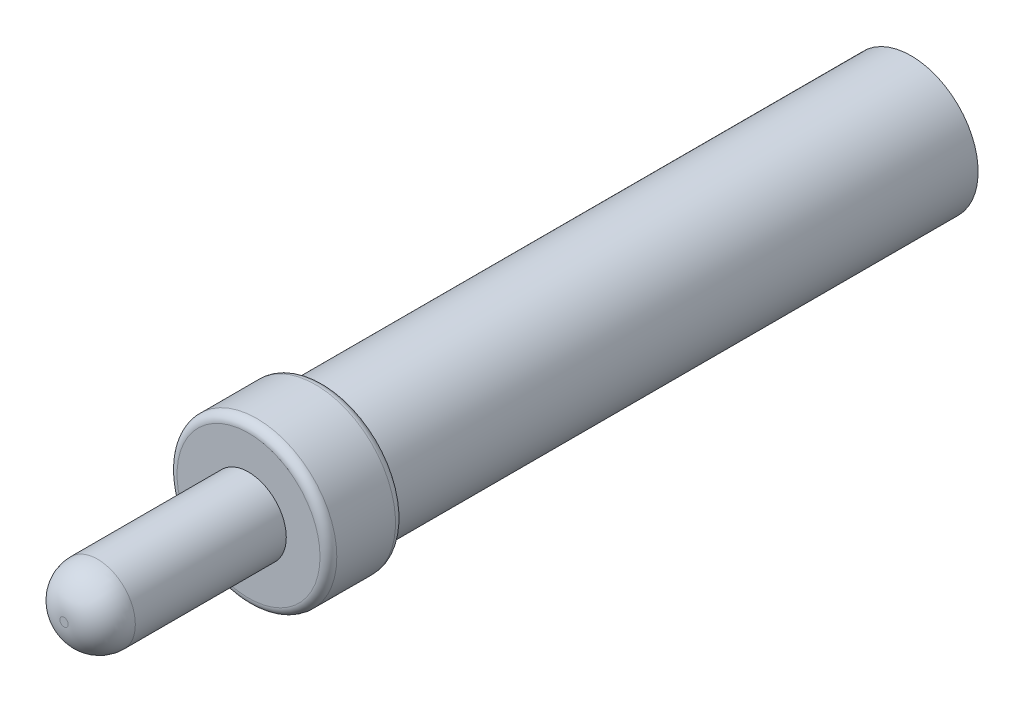
ISO-10303-21;
HEADER;
FILE_DESCRIPTION(('STEP AP214'),'2;1');
FILE_NAME('part.step','',(''),(''),'','','');
FILE_SCHEMA(('AUTOMOTIVE_DESIGN { 1 0 10303 214 1 1 1 1 }'));
ENDSEC;
DATA;
#1=APPLICATION_CONTEXT('core data for automotive mechanical design processes');
#2=APPLICATION_PROTOCOL_DEFINITION('international standard','automotive_design',2000,#1);
#3=PRODUCT_CONTEXT('',#1,'mechanical');
#4=PRODUCT('Part','Part','',(#3));
#5=PRODUCT_RELATED_PRODUCT_CATEGORY('part','',(#4));
#6=PRODUCT_DEFINITION_FORMATION('','',#4);
#7=PRODUCT_DEFINITION_CONTEXT('part definition',#1,'design');
#8=PRODUCT_DEFINITION('design','',#6,#7);
#9=PRODUCT_DEFINITION_SHAPE('','',#8);
#10=(LENGTH_UNIT() NAMED_UNIT(*) SI_UNIT(.MILLI.,.METRE.));
#11=(NAMED_UNIT(*) PLANE_ANGLE_UNIT() SI_UNIT($,.RADIAN.));
#12=(NAMED_UNIT(*) SI_UNIT($,.STERADIAN.) SOLID_ANGLE_UNIT());
#13=UNCERTAINTY_MEASURE_WITH_UNIT(LENGTH_MEASURE(1.E-05),#10,'distance_accuracy_value','');
#14=(GEOMETRIC_REPRESENTATION_CONTEXT(3) GLOBAL_UNCERTAINTY_ASSIGNED_CONTEXT((#13)) GLOBAL_UNIT_ASSIGNED_CONTEXT((#10,
#11,#12)) REPRESENTATION_CONTEXT('',''));
#15=CARTESIAN_POINT('',(0.,0.,0.));
#16=DIRECTION('',(0.,0.,1.));
#17=DIRECTION('',(1.,0.,0.));
#18=AXIS2_PLACEMENT_3D('',#15,#16,#17);
#19=CARTESIAN_POINT('',(240.708388301789,2.59608285867283,50.5));
#20=DIRECTION('',(0.,0.,-1.));
#21=DIRECTION('',(-1.,0.,0.));
#22=AXIS2_PLACEMENT_3D('',#19,#20,#21);
#23=CYLINDRICAL_SURFACE('',#22,4.76250000000001);
#24=CARTESIAN_POINT('',(240.708388301789,2.59608285867283,35.5));
#25=DIRECTION('',(0.,0.,-1.));
#26=DIRECTION('',(-1.,0.,0.));
#27=AXIS2_PLACEMENT_3D('',#24,#25,#26);
#28=CIRCLE('',#27,4.76250000000001);
#29=CARTESIAN_POINT('',(235.945888301789,2.59608285867283,35.5));
#30=VERTEX_POINT('',#29);
#31=EDGE_CURVE('E42',#30,#30,#28,.F.);
#32=ORIENTED_EDGE('',*,*,#31,.T.);
#33=EDGE_LOOP('',(#32));
#34=FACE_BOUND('',#33,.T.);
#35=CARTESIAN_POINT('',(240.708388301789,2.59608285867283,39.));
#36=DIRECTION('',(0.,0.,1.));
#37=DIRECTION('',(1.,0.,0.));
#38=AXIS2_PLACEMENT_3D('',#35,#36,#37);
#39=CIRCLE('',#38,4.76250000000001);
#40=CARTESIAN_POINT('',(245.470888301789,2.59608285867283,39.));
#41=VERTEX_POINT('',#40);
#42=EDGE_CURVE('E71',#41,#41,#39,.F.);
#43=ORIENTED_EDGE('',*,*,#42,.T.);
#44=EDGE_LOOP('',(#43));
#45=FACE_BOUND('',#44,.T.);
#46=ADVANCED_FACE('F35',(#34,#45),#23,.T.);
#47=CARTESIAN_POINT('',(240.708388301789,2.59608285867283,0.));
#48=DIRECTION('',(0.,0.,1.));
#49=DIRECTION('',(1.,0.,0.));
#50=AXIS2_PLACEMENT_3D('',#47,#48,#49);
#51=PLANE('',#50);
#52=CARTESIAN_POINT('',(240.708388301787,2.59608285867252,0.));
#53=DIRECTION('',(0.,0.,-1.));
#54=DIRECTION('',(-1.,0.,0.));
#55=AXIS2_PLACEMENT_3D('',#52,#53,#54);
#56=CIRCLE('',#55,1.25);
#57=CARTESIAN_POINT('',(239.458388301787,2.59608285867252,0.));
#58=VERTEX_POINT('',#57);
#59=EDGE_CURVE('E56',#58,#58,#56,.T.);
#60=ORIENTED_EDGE('',*,*,#59,.F.);
#61=EDGE_LOOP('',(#60));
#62=FACE_BOUND('',#61,.T.);
#63=CARTESIAN_POINT('',(240.708388301787,2.59608285867252,0.));
#64=DIRECTION('',(0.,0.,-1.));
#65=DIRECTION('',(-1.,0.,0.));
#66=AXIS2_PLACEMENT_3D('',#63,#64,#65);
#67=CIRCLE('',#66,3.99999999999999);
#68=CARTESIAN_POINT('',(236.708388301787,2.59608285867252,0.));
#69=VERTEX_POINT('',#68);
#70=EDGE_CURVE('E92',#69,#69,#67,.T.);
#71=ORIENTED_EDGE('',*,*,#70,.T.);
#72=EDGE_LOOP('',(#71));
#73=FACE_BOUND('',#72,.T.);
#74=ADVANCED_FACE('F49',(#62,#73),#51,.F.);
#75=CARTESIAN_POINT('',(240.708388301787,2.59608285867252,8.49999999999999));
#76=DIRECTION('',(0.,0.,-1.));
#77=DIRECTION('',(-1.,0.,0.));
#78=AXIS2_PLACEMENT_3D('',#75,#76,#77);
#79=CONICAL_SURFACE('',#78,1.25,1.02974425867666);
#80=CARTESIAN_POINT('',(240.708388301787,2.59608285867252,9.25107577378444));
#81=VERTEX_POINT('',#80);
#82=VERTEX_LOOP('',#81);
#83=FACE_BOUND('',#82,.T.);
#84=CARTESIAN_POINT('',(240.708388301787,2.59608285867252,8.49999999999999));
#85=DIRECTION('',(0.,0.,-1.));
#86=DIRECTION('',(-1.,0.,0.));
#87=AXIS2_PLACEMENT_3D('',#84,#85,#86);
#88=CIRCLE('',#87,1.25);
#89=CARTESIAN_POINT('',(239.458388301787,2.59608285867252,8.49999999999999));
#90=VERTEX_POINT('',#89);
#91=EDGE_CURVE('E53',#90,#90,#88,.T.);
#92=ORIENTED_EDGE('',*,*,#91,.T.);
#93=EDGE_LOOP('',(#92));
#94=FACE_BOUND('',#93,.T.);
#95=ADVANCED_FACE('F45',(#83,#94),#79,.F.);
#96=CARTESIAN_POINT('',(240.708388301787,2.59608285867252,0.));
#97=DIRECTION('',(0.,0.,-1.));
#98=DIRECTION('',(-1.,0.,0.));
#99=AXIS2_PLACEMENT_3D('',#96,#97,#98);
#100=CYLINDRICAL_SURFACE('',#99,1.25);
#101=ORIENTED_EDGE('',*,*,#91,.F.);
#102=EDGE_LOOP('',(#101));
#103=FACE_BOUND('',#102,.T.);
#104=ORIENTED_EDGE('',*,*,#59,.T.);
#105=EDGE_LOOP('',(#104));
#106=FACE_BOUND('',#105,.T.);
#107=ADVANCED_FACE('F48',(#103,#106),#100,.F.);
#108=CARTESIAN_POINT('',(240.708388301789,2.59608285867283,35.));
#109=DIRECTION('',(0.,0.,-1.));
#110=DIRECTION('',(-1.,0.,0.));
#111=AXIS2_PLACEMENT_3D('',#108,#109,#110);
#112=PLANE('',#111);
#113=CARTESIAN_POINT('',(240.708388301789,2.59608285867283,35.));
#114=DIRECTION('',(0.,0.,-1.));
#115=DIRECTION('',(-1.,0.,0.));
#116=AXIS2_PLACEMENT_3D('',#113,#114,#115);
#117=CIRCLE('',#116,4.26250000000001);
#118=CARTESIAN_POINT('',(236.445888301789,2.59608285867283,35.));
#119=VERTEX_POINT('',#118);
#120=EDGE_CURVE('E68',#119,#119,#117,.T.);
#121=ORIENTED_EDGE('',*,*,#120,.T.);
#122=EDGE_LOOP('',(#121));
#123=FACE_BOUND('',#122,.T.);
#124=CARTESIAN_POINT('',(240.708388301787,2.59608285867252,35.));
#125=DIRECTION('',(0.,0.,-1.));
#126=DIRECTION('',(-1.,0.,0.));
#127=AXIS2_PLACEMENT_3D('',#124,#125,#126);
#128=CIRCLE('',#127,3.99999999999999);
#129=CARTESIAN_POINT('',(236.708388301787,2.59608285867252,35.));
#130=VERTEX_POINT('',#129);
#131=EDGE_CURVE('E62',#130,#130,#128,.T.);
#132=ORIENTED_EDGE('',*,*,#131,.F.);
#133=EDGE_LOOP('',(#132));
#134=FACE_BOUND('',#133,.T.);
#135=ADVANCED_FACE('F84',(#123,#134),#112,.T.);
#136=CARTESIAN_POINT('',(240.708388301787,2.59608285867252,35.));
#137=DIRECTION('',(0.,0.,-1.));
#138=DIRECTION('',(-1.,0.,0.));
#139=AXIS2_PLACEMENT_3D('',#136,#137,#138);
#140=CYLINDRICAL_SURFACE('',#139,3.99999999999999);
#141=ORIENTED_EDGE('',*,*,#131,.T.);
#142=EDGE_LOOP('',(#141));
#143=FACE_BOUND('',#142,.T.);
#144=ORIENTED_EDGE('',*,*,#70,.F.);
#145=EDGE_LOOP('',(#144));
#146=FACE_BOUND('',#145,.T.);
#147=ADVANCED_FACE('F87',(#143,#146),#140,.T.);
#148=CARTESIAN_POINT('',(240.708388301789,2.59608285867283,39.5));
#149=DIRECTION('',(0.,0.,1.));
#150=DIRECTION('',(1.,0.,0.));
#151=AXIS2_PLACEMENT_3D('',#148,#149,#150);
#152=PLANE('',#151);
#153=CARTESIAN_POINT('',(240.708388301789,2.59608285867283,39.5));
#154=DIRECTION('',(0.,0.,1.));
#155=DIRECTION('',(1.,0.,0.));
#156=AXIS2_PLACEMENT_3D('',#153,#154,#155);
#157=CIRCLE('',#156,4.26250000000001);
#158=CARTESIAN_POINT('',(244.970888301789,2.59608285867283,39.5));
#159=VERTEX_POINT('',#158);
#160=EDGE_CURVE('E12',#159,#159,#157,.T.);
#161=ORIENTED_EDGE('',*,*,#160,.T.);
#162=EDGE_LOOP('',(#161));
#163=FACE_BOUND('',#162,.T.);
#164=CARTESIAN_POINT('',(240.708388301789,2.59608285867283,39.5));
#165=DIRECTION('',(0.,0.,1.));
#166=DIRECTION('',(1.,0.,0.));
#167=AXIS2_PLACEMENT_3D('',#164,#165,#166);
#168=CIRCLE('',#167,2.25000000000001);
#169=CARTESIAN_POINT('',(242.958388301789,2.59608285867283,39.5));
#170=VERTEX_POINT('',#169);
#171=EDGE_CURVE('E95',#170,#170,#168,.T.);
#172=ORIENTED_EDGE('',*,*,#171,.F.);
#173=EDGE_LOOP('',(#172));
#174=FACE_BOUND('',#173,.T.);
#175=ADVANCED_FACE('F102',(#163,#174),#152,.T.);
#176=CARTESIAN_POINT('',(240.708388301789,2.59608285867283,39.5));
#177=DIRECTION('',(0.,0.,1.));
#178=DIRECTION('',(1.,0.,0.));
#179=AXIS2_PLACEMENT_3D('',#176,#177,#178);
#180=CYLINDRICAL_SURFACE('',#179,2.25000000000001);
#181=CARTESIAN_POINT('',(240.708388301789,2.59608285867283,48.5));
#182=DIRECTION('',(0.,0.,1.));
#183=DIRECTION('',(1.,0.,0.));
#184=AXIS2_PLACEMENT_3D('',#181,#182,#183);
#185=CIRCLE('',#184,2.25000000000001);
#186=CARTESIAN_POINT('',(242.958388301789,2.59608285867283,48.5));
#187=VERTEX_POINT('',#186);
#188=EDGE_CURVE('E59',#187,#187,#185,.F.);
#189=ORIENTED_EDGE('',*,*,#188,.T.);
#190=EDGE_LOOP('',(#189));
#191=FACE_BOUND('',#190,.T.);
#192=ORIENTED_EDGE('',*,*,#171,.T.);
#193=EDGE_LOOP('',(#192));
#194=FACE_BOUND('',#193,.T.);
#195=ADVANCED_FACE('F100',(#191,#194),#180,.T.);
#196=CARTESIAN_POINT('',(240.708388301789,2.59608285867283,50.5));
#197=DIRECTION('',(0.,0.,1.));
#198=DIRECTION('',(1.,0.,0.));
#199=AXIS2_PLACEMENT_3D('',#196,#197,#198);
#200=PLANE('',#199);
#201=CARTESIAN_POINT('',(240.708388301789,2.59608285867283,50.5));
#202=DIRECTION('',(0.,0.,1.));
#203=DIRECTION('',(1.,0.,0.));
#204=AXIS2_PLACEMENT_3D('',#201,#202,#203);
#205=CIRCLE('',#204,0.250000000000009);
#206=CARTESIAN_POINT('',(240.958388301789,2.59608285867283,50.5));
#207=VERTEX_POINT('',#206);
#208=EDGE_CURVE('E55',#207,#207,#205,.T.);
#209=ORIENTED_EDGE('',*,*,#208,.T.);
#210=EDGE_LOOP('',(#209));
#211=FACE_BOUND('',#210,.T.);
#212=ADVANCED_FACE('F110',(#211),#200,.T.);
#213=CARTESIAN_POINT('',(240.708388301789,2.59608285867283,48.5));
#214=DIRECTION('',(0.,0.,1.));
#215=DIRECTION('',(1.,0.,0.));
#216=AXIS2_PLACEMENT_3D('',#213,#214,#215);
#217=DEGENERATE_TOROIDAL_SURFACE('',#216,0.250000000000009,2.,.T.);
#218=ORIENTED_EDGE('',*,*,#188,.F.);
#219=EDGE_LOOP('',(#218));
#220=FACE_BOUND('',#219,.T.);
#221=ORIENTED_EDGE('',*,*,#208,.F.);
#222=EDGE_LOOP('',(#221));
#223=FACE_BOUND('',#222,.T.);
#224=ADVANCED_FACE('F81',(#220,#223),#217,.T.);
#225=CARTESIAN_POINT('',(240.708388301789,2.59608285867283,35.5));
#226=DIRECTION('',(0.,0.,-1.));
#227=DIRECTION('',(-1.,0.,0.));
#228=AXIS2_PLACEMENT_3D('',#225,#226,#227);
#229=TOROIDAL_SURFACE('',#228,4.26250000000001,0.5);
#230=ORIENTED_EDGE('',*,*,#31,.F.);
#231=EDGE_LOOP('',(#230));
#232=FACE_BOUND('',#231,.T.);
#233=ORIENTED_EDGE('',*,*,#120,.F.);
#234=EDGE_LOOP('',(#233));
#235=FACE_BOUND('',#234,.T.);
#236=ADVANCED_FACE('F78',(#232,#235),#229,.T.);
#237=CARTESIAN_POINT('',(240.708388301789,2.59608285867283,39.));
#238=DIRECTION('',(0.,0.,1.));
#239=DIRECTION('',(1.,0.,0.));
#240=AXIS2_PLACEMENT_3D('',#237,#238,#239);
#241=TOROIDAL_SURFACE('',#240,4.26250000000001,0.5);
#242=ORIENTED_EDGE('',*,*,#42,.F.);
#243=EDGE_LOOP('',(#242));
#244=FACE_BOUND('',#243,.T.);
#245=ORIENTED_EDGE('',*,*,#160,.F.);
#246=EDGE_LOOP('',(#245));
#247=FACE_BOUND('',#246,.T.);
#248=ADVANCED_FACE('F37',(#244,#247),#241,.T.);
#249=CLOSED_SHELL('',(#46,#74,#95,#107,#135,#147,#175,#195,#212,#224,#236,#248));
#250=MANIFOLD_SOLID_BREP('B2',#249);
#251=ADVANCED_BREP_SHAPE_REPRESENTATION('',(#18,#250),#14);
#252=SHAPE_DEFINITION_REPRESENTATION(#9,#251);
ENDSEC;
END-ISO-10303-21;
